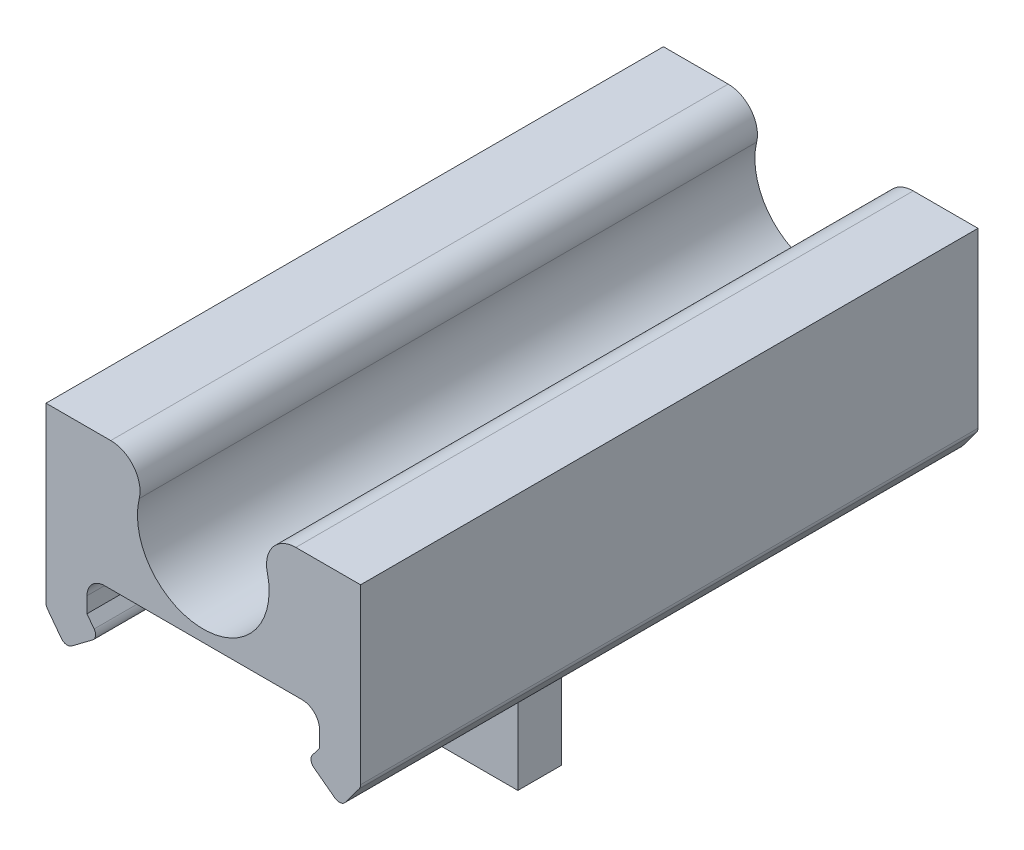
ISO-10303-21;
HEADER;
FILE_DESCRIPTION(('STEP AP214'),'2;1');
FILE_NAME('part.step','',(''),(''),'','','');
FILE_SCHEMA(('AUTOMOTIVE_DESIGN { 1 0 10303 214 1 1 1 1 }'));
ENDSEC;
DATA;
#1=APPLICATION_CONTEXT('core data for automotive mechanical design processes');
#2=APPLICATION_PROTOCOL_DEFINITION('international standard','automotive_design',2000,#1);
#3=PRODUCT_CONTEXT('',#1,'mechanical');
#4=PRODUCT('Part','Part','',(#3));
#5=PRODUCT_RELATED_PRODUCT_CATEGORY('part','',(#4));
#6=PRODUCT_DEFINITION_FORMATION('','',#4);
#7=PRODUCT_DEFINITION_CONTEXT('part definition',#1,'design');
#8=PRODUCT_DEFINITION('design','',#6,#7);
#9=PRODUCT_DEFINITION_SHAPE('','',#8);
#10=(LENGTH_UNIT() NAMED_UNIT(*) SI_UNIT(.MILLI.,.METRE.));
#11=(NAMED_UNIT(*) PLANE_ANGLE_UNIT() SI_UNIT($,.RADIAN.));
#12=(NAMED_UNIT(*) SI_UNIT($,.STERADIAN.) SOLID_ANGLE_UNIT());
#13=UNCERTAINTY_MEASURE_WITH_UNIT(LENGTH_MEASURE(1.E-05),#10,'distance_accuracy_value','');
#14=(GEOMETRIC_REPRESENTATION_CONTEXT(3) GLOBAL_UNCERTAINTY_ASSIGNED_CONTEXT((#13)) GLOBAL_UNIT_ASSIGNED_CONTEXT((#10,
#11,#12)) REPRESENTATION_CONTEXT('',''));
#15=CARTESIAN_POINT('',(0.,0.,0.));
#16=DIRECTION('',(0.,0.,1.));
#17=DIRECTION('',(1.,0.,0.));
#18=AXIS2_PLACEMENT_3D('',#15,#16,#17);
#19=CARTESIAN_POINT('',(0.,29.3,0.));
#20=DIRECTION('',(0.,1.,0.));
#21=DIRECTION('',(0.,0.,1.));
#22=AXIS2_PLACEMENT_3D('',#19,#20,#21);
#23=PLANE('',#22);
#24=DIRECTION('',(1.,0.,0.));
#25=VECTOR('',#24,1.);
#26=CARTESIAN_POINT('',(-16.,29.3,0.));
#27=LINE('',#26,#25);
#28=CARTESIAN_POINT('',(-16.,29.3,0.));
#29=VERTEX_POINT('',#28);
#30=CARTESIAN_POINT('',(-11.5745553203368,29.3,0.));
#31=VERTEX_POINT('',#30);
#32=EDGE_CURVE('E260',#29,#31,#27,.T.);
#33=ORIENTED_EDGE('',*,*,#32,.T.);
#34=DIRECTION('',(0.,0.,-1.));
#35=VECTOR('',#34,1.);
#36=CARTESIAN_POINT('',(-11.5745553203368,29.3,-42.2));
#37=LINE('',#36,#35);
#38=CARTESIAN_POINT('',(-11.5745553203368,29.3,-42.2));
#39=VERTEX_POINT('',#38);
#40=EDGE_CURVE('E381',#31,#39,#37,.T.);
#41=ORIENTED_EDGE('',*,*,#40,.T.);
#42=DIRECTION('',(-1.,0.,0.));
#43=VECTOR('',#42,1.);
#44=CARTESIAN_POINT('',(5.49999999999991,29.3,-42.2));
#45=LINE('',#44,#43);
#46=CARTESIAN_POINT('',(-16.,29.3,-42.2));
#47=VERTEX_POINT('',#46);
#48=EDGE_CURVE('E244',#39,#47,#45,.T.);
#49=ORIENTED_EDGE('',*,*,#48,.T.);
#50=DIRECTION('',(0.,0.,1.));
#51=VECTOR('',#50,1.);
#52=CARTESIAN_POINT('',(-16.,29.3,-42.2));
#53=LINE('',#52,#51);
#54=EDGE_CURVE('E243',#47,#29,#53,.T.);
#55=ORIENTED_EDGE('',*,*,#54,.T.);
#56=EDGE_LOOP('',(#33,#41,#49,#55));
#57=FACE_BOUND('',#56,.T.);
#58=ADVANCED_FACE('F41',(#57),#23,.T.);
#59=CARTESIAN_POINT('',(0.,20.5,0.));
#60=DIRECTION('',(0.,-1.,0.));
#61=DIRECTION('',(0.,0.,-1.));
#62=AXIS2_PLACEMENT_3D('',#59,#60,#61);
#63=PLANE('',#62);
#64=DIRECTION('',(-1.,0.,0.));
#65=VECTOR('',#64,1.);
#66=CARTESIAN_POINT('',(0.,20.5,-42.2));
#67=LINE('',#66,#65);
#68=CARTESIAN_POINT('',(1.49999999999991,20.5,-42.2));
#69=VERTEX_POINT('',#68);
#70=CARTESIAN_POINT('',(-12.,20.5,-42.2));
#71=VERTEX_POINT('',#70);
#72=EDGE_CURVE('E317',#69,#71,#67,.T.);
#73=ORIENTED_EDGE('',*,*,#72,.F.);
#74=DIRECTION('',(0.,0.,-1.));
#75=VECTOR('',#74,1.);
#76=CARTESIAN_POINT('',(1.49999999999991,20.5,0.));
#77=LINE('',#76,#75);
#78=CARTESIAN_POINT('',(1.49999999999991,20.5,0.));
#79=VERTEX_POINT('',#78);
#80=EDGE_CURVE('E339',#79,#69,#77,.T.);
#81=ORIENTED_EDGE('',*,*,#80,.F.);
#82=DIRECTION('',(-1.,0.,0.));
#83=VECTOR('',#82,1.);
#84=CARTESIAN_POINT('',(0.,20.5,0.));
#85=LINE('',#84,#83);
#86=CARTESIAN_POINT('',(-12.,20.5,0.));
#87=VERTEX_POINT('',#86);
#88=EDGE_CURVE('E299',#79,#87,#85,.T.);
#89=ORIENTED_EDGE('',*,*,#88,.T.);
#90=DIRECTION('',(0.,0.,-1.));
#91=VECTOR('',#90,1.);
#92=CARTESIAN_POINT('',(-12.,20.5,0.));
#93=LINE('',#92,#91);
#94=EDGE_CURVE('E341',#87,#71,#93,.T.);
#95=ORIENTED_EDGE('',*,*,#94,.T.);
#96=EDGE_LOOP('',(#73,#81,#89,#95));
#97=FACE_BOUND('',#96,.T.);
#98=DIRECTION('',(1.,0.,0.));
#99=VECTOR('',#98,1.);
#100=CARTESIAN_POINT('',(-10.2500000000001,20.5,-19.5));
#101=LINE('',#100,#99);
#102=CARTESIAN_POINT('',(-10.2500000000001,20.5,-19.5));
#103=VERTEX_POINT('',#102);
#104=CARTESIAN_POINT('',(-0.250000000000049,20.5,-19.5));
#105=VERTEX_POINT('',#104);
#106=EDGE_CURVE('E277',#103,#105,#101,.T.);
#107=ORIENTED_EDGE('',*,*,#106,.F.);
#108=DIRECTION('',(0.,0.,-1.));
#109=VECTOR('',#108,1.);
#110=CARTESIAN_POINT('',(-10.2500000000001,20.5,-16.5));
#111=LINE('',#110,#109);
#112=CARTESIAN_POINT('',(-10.2500000000001,20.5,-16.5));
#113=VERTEX_POINT('',#112);
#114=EDGE_CURVE('E263',#113,#103,#111,.T.);
#115=ORIENTED_EDGE('',*,*,#114,.F.);
#116=DIRECTION('',(-1.,0.,0.));
#117=VECTOR('',#116,1.);
#118=CARTESIAN_POINT('',(-10.2500000000001,20.5,-16.5));
#119=LINE('',#118,#117);
#120=CARTESIAN_POINT('',(-0.250000000000051,20.5,-16.5));
#121=VERTEX_POINT('',#120);
#122=EDGE_CURVE('E268',#121,#113,#119,.T.);
#123=ORIENTED_EDGE('',*,*,#122,.F.);
#124=DIRECTION('',(0.,0.,1.));
#125=VECTOR('',#124,1.);
#126=CARTESIAN_POINT('',(-0.250000000000051,20.5,-16.5));
#127=LINE('',#126,#125);
#128=EDGE_CURVE('E279',#105,#121,#127,.T.);
#129=ORIENTED_EDGE('',*,*,#128,.F.);
#130=EDGE_LOOP('',(#107,#115,#123,#129));
#131=FACE_BOUND('',#130,.T.);
#132=ADVANCED_FACE('F462',(#97,#131),#63,.T.);
#133=CARTESIAN_POINT('',(0.,0.,0.));
#134=DIRECTION('',(0.,0.,1.));
#135=DIRECTION('',(1.,0.,0.));
#136=AXIS2_PLACEMENT_3D('',#133,#134,#135);
#137=PLANE('',#136);
#138=DIRECTION('',(0.599999999999996,0.800000000000003,0.));
#139=VECTOR('',#138,1.);
#140=CARTESIAN_POINT('',(-7.02400000000001,5.26799999999995,0.));
#141=LINE('',#140,#139);
#142=CARTESIAN_POINT('',(2.20999999999991,17.58,0.));
#143=VERTEX_POINT('',#142);
#144=CARTESIAN_POINT('',(2.69999999999992,18.2333333333333,0.));
#145=VERTEX_POINT('',#144);
#146=EDGE_CURVE('E306',#143,#145,#141,.T.);
#147=ORIENTED_EDGE('',*,*,#146,.F.);
#148=CARTESIAN_POINT('',(2.60999999999991,17.28,0.));
#149=DIRECTION('',(0.,0.,1.));
#150=DIRECTION('',(1.,0.,0.));
#151=AXIS2_PLACEMENT_3D('',#148,#149,#150);
#152=CIRCLE('',#151,0.5);
#153=CARTESIAN_POINT('',(2.30999999999991,16.88,0.));
#154=VERTEX_POINT('',#153);
#155=EDGE_CURVE('E417',#143,#154,#152,.T.);
#156=ORIENTED_EDGE('',*,*,#155,.T.);
#157=DIRECTION('',(0.799999999999999,-0.600000000000001,0.));
#158=VECTOR('',#157,1.);
#159=CARTESIAN_POINT('',(8.93399999999997,11.9119999999999,0.));
#160=LINE('',#159,#158);
#161=CARTESIAN_POINT('',(3.74999999999991,15.8,0.));
#162=VERTEX_POINT('',#161);
#163=EDGE_CURVE('E333',#154,#162,#160,.T.);
#164=ORIENTED_EDGE('',*,*,#163,.T.);
#165=CARTESIAN_POINT('',(4.04999999999991,16.2,0.));
#166=DIRECTION('',(0.,0.,1.));
#167=DIRECTION('',(1.,0.,0.));
#168=AXIS2_PLACEMENT_3D('',#165,#166,#167);
#169=CIRCLE('',#168,0.5);
#170=CARTESIAN_POINT('',(4.44999999999991,15.9,0.));
#171=VERTEX_POINT('',#170);
#172=EDGE_CURVE('E408',#162,#171,#169,.T.);
#173=ORIENTED_EDGE('',*,*,#172,.T.);
#174=DIRECTION('',(0.600000000000001,0.799999999999999,0.));
#175=VECTOR('',#174,1.);
#176=CARTESIAN_POINT('',(-4.78400000000007,3.58800000000006,0.));
#177=LINE('',#176,#175);
#178=CARTESIAN_POINT('',(5.39999999999991,17.1666666666667,0.));
#179=VERTEX_POINT('',#178);
#180=EDGE_CURVE('E360',#171,#179,#177,.T.);
#181=ORIENTED_EDGE('',*,*,#180,.T.);
#182=CARTESIAN_POINT('',(4.99999999999991,17.4666666666667,0.));
#183=DIRECTION('',(0.,0.,1.));
#184=DIRECTION('',(1.,0.,0.));
#185=AXIS2_PLACEMENT_3D('',#182,#183,#184);
#186=CIRCLE('',#185,0.5);
#187=CARTESIAN_POINT('',(5.49999999999991,17.4666666666667,0.));
#188=VERTEX_POINT('',#187);
#189=EDGE_CURVE('E56',#179,#188,#186,.T.);
#190=ORIENTED_EDGE('',*,*,#189,.T.);
#191=DIRECTION('',(0.,1.,0.));
#192=VECTOR('',#191,1.);
#193=CARTESIAN_POINT('',(5.49999999999991,0.,0.));
#194=LINE('',#193,#192);
#195=CARTESIAN_POINT('',(5.49999999999991,29.3,0.));
#196=VERTEX_POINT('',#195);
#197=EDGE_CURVE('E362',#188,#196,#194,.T.);
#198=ORIENTED_EDGE('',*,*,#197,.T.);
#199=CARTESIAN_POINT('',(1.07455532033671,29.3,0.));
#200=VERTEX_POINT('',#199);
#201=EDGE_CURVE('E249',#200,#196,#27,.T.);
#202=ORIENTED_EDGE('',*,*,#201,.F.);
#203=CARTESIAN_POINT('',(1.07455532033671,27.3,0.));
#204=DIRECTION('',(0.,0.,1.));
#205=DIRECTION('',(1.,0.,0.));
#206=AXIS2_PLACEMENT_3D('',#203,#204,#205);
#207=CIRCLE('',#206,2.);
#208=CARTESIAN_POINT('',(-0.871461701305374,26.8384615384615,0.));
#209=VERTEX_POINT('',#208);
#210=EDGE_CURVE('E377',#200,#209,#207,.T.);
#211=ORIENTED_EDGE('',*,*,#210,.T.);
#212=CARTESIAN_POINT('',(-5.25000000000005,25.8,0.));
#213=DIRECTION('',(0.,0.,1.));
#214=DIRECTION('',(1.,0.,0.));
#215=AXIS2_PLACEMENT_3D('',#212,#213,#214);
#216=CIRCLE('',#215,4.5);
#217=CARTESIAN_POINT('',(-9.62853829869473,26.8384615384615,0.));
#218=VERTEX_POINT('',#217);
#219=EDGE_CURVE('E254',#218,#209,#216,.T.);
#220=ORIENTED_EDGE('',*,*,#219,.F.);
#221=CARTESIAN_POINT('',(-11.5745553203368,27.3,0.));
#222=DIRECTION('',(0.,0.,1.));
#223=DIRECTION('',(1.,0.,0.));
#224=AXIS2_PLACEMENT_3D('',#221,#222,#223);
#225=CIRCLE('',#224,2.);
#226=EDGE_CURVE('E379',#218,#31,#225,.T.);
#227=ORIENTED_EDGE('',*,*,#226,.T.);
#228=ORIENTED_EDGE('',*,*,#32,.F.);
#229=DIRECTION('',(0.,-1.,0.));
#230=VECTOR('',#229,1.);
#231=CARTESIAN_POINT('',(-16.,0.,0.));
#232=LINE('',#231,#230);
#233=CARTESIAN_POINT('',(-16.,17.4666666666667,0.));
#234=VERTEX_POINT('',#233);
#235=EDGE_CURVE('E364',#29,#234,#232,.T.);
#236=ORIENTED_EDGE('',*,*,#235,.T.);
#237=CARTESIAN_POINT('',(-15.5,17.4666666666667,0.));
#238=DIRECTION('',(0.,0.,1.));
#239=DIRECTION('',(1.,0.,0.));
#240=AXIS2_PLACEMENT_3D('',#237,#238,#239);
#241=CIRCLE('',#240,0.5);
#242=CARTESIAN_POINT('',(-15.9,17.1666666666667,0.));
#243=VERTEX_POINT('',#242);
#244=EDGE_CURVE('E413',#234,#243,#241,.T.);
#245=ORIENTED_EDGE('',*,*,#244,.T.);
#246=DIRECTION('',(0.600000000000003,-0.799999999999998,0.));
#247=VECTOR('',#246,1.);
#248=CARTESIAN_POINT('',(-1.93599999999995,-1.45199999999997,0.));
#249=LINE('',#248,#247);
#250=CARTESIAN_POINT('',(-14.95,15.9,0.));
#251=VERTEX_POINT('',#250);
#252=EDGE_CURVE('E367',#243,#251,#249,.T.);
#253=ORIENTED_EDGE('',*,*,#252,.T.);
#254=CARTESIAN_POINT('',(-14.55,16.2,0.));
#255=DIRECTION('',(0.,0.,1.));
#256=DIRECTION('',(1.,0.,0.));
#257=AXIS2_PLACEMENT_3D('',#254,#255,#256);
#258=CIRCLE('',#257,0.5);
#259=CARTESIAN_POINT('',(-14.25,15.8,0.));
#260=VERTEX_POINT('',#259);
#261=EDGE_CURVE('E411',#251,#260,#258,.T.);
#262=ORIENTED_EDGE('',*,*,#261,.T.);
#263=DIRECTION('',(-0.799999999999999,-0.600000000000001,0.));
#264=VECTOR('',#263,1.);
#265=CARTESIAN_POINT('',(-12.714,16.952,0.));
#266=LINE('',#265,#264);
#267=CARTESIAN_POINT('',(-12.81,16.88,0.));
#268=VERTEX_POINT('',#267);
#269=EDGE_CURVE('E347',#268,#260,#266,.T.);
#270=ORIENTED_EDGE('',*,*,#269,.F.);
#271=CARTESIAN_POINT('',(-13.11,17.28,0.));
#272=DIRECTION('',(0.,0.,1.));
#273=DIRECTION('',(1.,0.,0.));
#274=AXIS2_PLACEMENT_3D('',#271,#272,#273);
#275=CIRCLE('',#274,0.5);
#276=CARTESIAN_POINT('',(-12.71,17.58,0.));
#277=VERTEX_POINT('',#276);
#278=EDGE_CURVE('E415',#268,#277,#275,.T.);
#279=ORIENTED_EDGE('',*,*,#278,.T.);
#280=DIRECTION('',(0.599999999999996,-0.800000000000003,0.));
#281=VECTOR('',#280,1.);
#282=CARTESIAN_POINT('',(0.303999999999906,0.227999999999925,0.));
#283=LINE('',#282,#281);
#284=CARTESIAN_POINT('',(-13.2,18.2333333333333,0.));
#285=VERTEX_POINT('',#284);
#286=EDGE_CURVE('E308',#285,#277,#283,.T.);
#287=ORIENTED_EDGE('',*,*,#286,.F.);
#288=DIRECTION('',(0.,-1.,0.));
#289=VECTOR('',#288,1.);
#290=CARTESIAN_POINT('',(-13.2,0.,0.));
#291=LINE('',#290,#289);
#292=CARTESIAN_POINT('',(-13.2,19.3,0.));
#293=VERTEX_POINT('',#292);
#294=EDGE_CURVE('E293',#293,#285,#291,.T.);
#295=ORIENTED_EDGE('',*,*,#294,.F.);
#296=CARTESIAN_POINT('',(-12.,19.3,0.));
#297=DIRECTION('',(0.,0.,-1.));
#298=DIRECTION('',(-1.,0.,0.));
#299=AXIS2_PLACEMENT_3D('',#296,#297,#298);
#300=CIRCLE('',#299,1.2);
#301=EDGE_CURVE('E295',#293,#87,#300,.T.);
#302=ORIENTED_EDGE('',*,*,#301,.T.);
#303=ORIENTED_EDGE('',*,*,#88,.F.);
#304=CARTESIAN_POINT('',(1.49999999999991,19.3,0.));
#305=DIRECTION('',(0.,0.,-1.));
#306=DIRECTION('',(-1.,0.,0.));
#307=AXIS2_PLACEMENT_3D('',#304,#305,#306);
#308=CIRCLE('',#307,1.2);
#309=CARTESIAN_POINT('',(2.69999999999991,19.3,0.));
#310=VERTEX_POINT('',#309);
#311=EDGE_CURVE('E301',#79,#310,#308,.T.);
#312=ORIENTED_EDGE('',*,*,#311,.T.);
#313=DIRECTION('',(0.,1.,0.));
#314=VECTOR('',#313,1.);
#315=CARTESIAN_POINT('',(2.69999999999991,0.,0.));
#316=LINE('',#315,#314);
#317=EDGE_CURVE('E304',#145,#310,#316,.T.);
#318=ORIENTED_EDGE('',*,*,#317,.F.);
#319=EDGE_LOOP('',(#147,#156,#164,#173,#181,#190,#198,#202,#211,#220,#227,#228,#236,#245,#253,
#262,#270,#279,#287,#295,#302,#303,#312,#318));
#320=FACE_BOUND('',#319,.T.);
#321=ADVANCED_FACE('F441',(#320),#137,.T.);
#322=CARTESIAN_POINT('',(8.93399999999997,11.9119999999999,-64.7497228364341));
#323=DIRECTION('',(-0.600000000000001,-0.799999999999999,0.));
#324=DIRECTION('',(0.799999999999999,-0.600000000000001,0.));
#325=AXIS2_PLACEMENT_3D('',#322,#323,#324);
#326=PLANE('',#325);
#327=ORIENTED_EDGE('',*,*,#163,.F.);
#328=DIRECTION('',(0.,0.,-1.));
#329=VECTOR('',#328,1.);
#330=CARTESIAN_POINT('',(2.30999999999991,16.88,-64.7497228364341));
#331=LINE('',#330,#329);
#332=CARTESIAN_POINT('',(2.30999999999991,16.88,-42.2));
#333=VERTEX_POINT('',#332);
#334=EDGE_CURVE('E391',#154,#333,#331,.T.);
#335=ORIENTED_EDGE('',*,*,#334,.T.);
#336=DIRECTION('',(-0.799999999999999,0.600000000000001,0.));
#337=VECTOR('',#336,1.);
#338=CARTESIAN_POINT('',(8.93399999999997,11.9119999999999,-42.2));
#339=LINE('',#338,#337);
#340=CARTESIAN_POINT('',(3.74999999999991,15.8,-42.2));
#341=VERTEX_POINT('',#340);
#342=EDGE_CURVE('E345',#341,#333,#339,.T.);
#343=ORIENTED_EDGE('',*,*,#342,.F.);
#344=DIRECTION('',(0.,0.,1.));
#345=VECTOR('',#344,1.);
#346=CARTESIAN_POINT('',(3.74999999999991,15.8,-64.7497228364341));
#347=LINE('',#346,#345);
#348=EDGE_CURVE('E388',#341,#162,#347,.T.);
#349=ORIENTED_EDGE('',*,*,#348,.T.);
#350=EDGE_LOOP('',(#327,#335,#343,#349));
#351=FACE_BOUND('',#350,.T.);
#352=ADVANCED_FACE('F448',(#351),#326,.T.);
#353=CARTESIAN_POINT('',(-12.714,16.952,-64.7497228364341));
#354=DIRECTION('',(-0.600000000000001,0.799999999999999,0.));
#355=DIRECTION('',(-0.799999999999999,-0.600000000000001,0.));
#356=AXIS2_PLACEMENT_3D('',#353,#354,#355);
#357=PLANE('',#356);
#358=DIRECTION('',(0.799999999999999,0.600000000000001,0.));
#359=VECTOR('',#358,1.);
#360=CARTESIAN_POINT('',(-12.714,16.952,-42.2));
#361=LINE('',#360,#359);
#362=CARTESIAN_POINT('',(-14.25,15.8,-42.2));
#363=VERTEX_POINT('',#362);
#364=CARTESIAN_POINT('',(-12.81,16.88,-42.2));
#365=VERTEX_POINT('',#364);
#366=EDGE_CURVE('E354',#363,#365,#361,.T.);
#367=ORIENTED_EDGE('',*,*,#366,.T.);
#368=DIRECTION('',(0.,0.,-1.));
#369=VECTOR('',#368,1.);
#370=CARTESIAN_POINT('',(-12.81,16.88,0.));
#371=LINE('',#370,#369);
#372=EDGE_CURVE('E424',#365,#268,#371,.F.);
#373=ORIENTED_EDGE('',*,*,#372,.T.);
#374=ORIENTED_EDGE('',*,*,#269,.T.);
#375=DIRECTION('',(0.,0.,1.));
#376=VECTOR('',#375,1.);
#377=CARTESIAN_POINT('',(-14.25,15.8,-42.2));
#378=LINE('',#377,#376);
#379=EDGE_CURVE('E422',#260,#363,#378,.F.);
#380=ORIENTED_EDGE('',*,*,#379,.T.);
#381=EDGE_LOOP('',(#367,#373,#374,#380));
#382=FACE_BOUND('',#381,.T.);
#383=ADVANCED_FACE('F528',(#382),#357,.F.);
#384=CARTESIAN_POINT('',(-10.,3.,-42.2));
#385=DIRECTION('',(0.,0.,1.));
#386=DIRECTION('',(1.,0.,0.));
#387=AXIS2_PLACEMENT_3D('',#384,#385,#386);
#388=PLANE('',#387);
#389=ORIENTED_EDGE('',*,*,#342,.T.);
#390=CARTESIAN_POINT('',(2.60999999999991,17.28,-42.2));
#391=DIRECTION('',(0.,0.,1.));
#392=DIRECTION('',(1.,0.,0.));
#393=AXIS2_PLACEMENT_3D('',#390,#391,#392);
#394=CIRCLE('',#393,0.5);
#395=CARTESIAN_POINT('',(2.20999999999991,17.58,-42.2));
#396=VERTEX_POINT('',#395);
#397=EDGE_CURVE('E404',#333,#396,#394,.F.);
#398=ORIENTED_EDGE('',*,*,#397,.T.);
#399=DIRECTION('',(0.599999999999996,0.800000000000003,0.));
#400=VECTOR('',#399,1.);
#401=CARTESIAN_POINT('',(-7.02400000000001,5.26799999999995,-42.2));
#402=LINE('',#401,#400);
#403=CARTESIAN_POINT('',(2.69999999999991,18.2333333333333,-42.2));
#404=VERTEX_POINT('',#403);
#405=EDGE_CURVE('E326',#396,#404,#402,.T.);
#406=ORIENTED_EDGE('',*,*,#405,.T.);
#407=DIRECTION('',(0.,1.,0.));
#408=VECTOR('',#407,1.);
#409=CARTESIAN_POINT('',(2.69999999999991,0.,-42.2));
#410=LINE('',#409,#408);
#411=CARTESIAN_POINT('',(2.69999999999991,19.3,-42.2));
#412=VERTEX_POINT('',#411);
#413=EDGE_CURVE('E323',#404,#412,#410,.T.);
#414=ORIENTED_EDGE('',*,*,#413,.T.);
#415=CARTESIAN_POINT('',(1.49999999999991,19.3,-42.2));
#416=DIRECTION('',(0.,0.,-1.));
#417=DIRECTION('',(-1.,0.,0.));
#418=AXIS2_PLACEMENT_3D('',#415,#416,#417);
#419=CIRCLE('',#418,1.2);
#420=EDGE_CURVE('E320',#69,#412,#419,.T.);
#421=ORIENTED_EDGE('',*,*,#420,.F.);
#422=ORIENTED_EDGE('',*,*,#72,.T.);
#423=CARTESIAN_POINT('',(-12.,19.3,-42.2));
#424=DIRECTION('',(0.,0.,-1.));
#425=DIRECTION('',(-1.,0.,0.));
#426=AXIS2_PLACEMENT_3D('',#423,#424,#425);
#427=CIRCLE('',#426,1.2);
#428=CARTESIAN_POINT('',(-13.2,19.3,-42.2));
#429=VERTEX_POINT('',#428);
#430=EDGE_CURVE('E314',#429,#71,#427,.T.);
#431=ORIENTED_EDGE('',*,*,#430,.F.);
#432=DIRECTION('',(0.,-1.,0.));
#433=VECTOR('',#432,1.);
#434=CARTESIAN_POINT('',(-13.2,0.,-42.2));
#435=LINE('',#434,#433);
#436=CARTESIAN_POINT('',(-13.2,18.2333333333333,-42.2));
#437=VERTEX_POINT('',#436);
#438=EDGE_CURVE('E292',#429,#437,#435,.T.);
#439=ORIENTED_EDGE('',*,*,#438,.T.);
#440=DIRECTION('',(0.599999999999996,-0.800000000000003,0.));
#441=VECTOR('',#440,1.);
#442=CARTESIAN_POINT('',(0.303999999999903,0.227999999999925,-42.2));
#443=LINE('',#442,#441);
#444=CARTESIAN_POINT('',(-12.71,17.58,-42.2));
#445=VERTEX_POINT('',#444);
#446=EDGE_CURVE('E296',#437,#445,#443,.T.);
#447=ORIENTED_EDGE('',*,*,#446,.T.);
#448=CARTESIAN_POINT('',(-13.11,17.28,-42.2));
#449=DIRECTION('',(0.,0.,1.));
#450=DIRECTION('',(1.,0.,0.));
#451=AXIS2_PLACEMENT_3D('',#448,#449,#450);
#452=CIRCLE('',#451,0.5);
#453=EDGE_CURVE('E402',#445,#365,#452,.F.);
#454=ORIENTED_EDGE('',*,*,#453,.T.);
#455=ORIENTED_EDGE('',*,*,#366,.F.);
#456=CARTESIAN_POINT('',(-14.55,16.2,-42.2));
#457=DIRECTION('',(0.,0.,1.));
#458=DIRECTION('',(1.,0.,0.));
#459=AXIS2_PLACEMENT_3D('',#456,#457,#458);
#460=CIRCLE('',#459,0.5);
#461=CARTESIAN_POINT('',(-14.95,15.9,-42.2));
#462=VERTEX_POINT('',#461);
#463=EDGE_CURVE('E398',#363,#462,#460,.F.);
#464=ORIENTED_EDGE('',*,*,#463,.T.);
#465=DIRECTION('',(-0.600000000000002,0.799999999999998,0.));
#466=VECTOR('',#465,1.);
#467=CARTESIAN_POINT('',(-1.93599999999995,-1.45199999999997,-42.2));
#468=LINE('',#467,#466);
#469=CARTESIAN_POINT('',(-15.9,17.1666666666667,-42.2));
#470=VERTEX_POINT('',#469);
#471=EDGE_CURVE('E351',#462,#470,#468,.T.);
#472=ORIENTED_EDGE('',*,*,#471,.T.);
#473=CARTESIAN_POINT('',(-15.5,17.4666666666667,-42.2));
#474=DIRECTION('',(0.,0.,1.));
#475=DIRECTION('',(1.,0.,0.));
#476=AXIS2_PLACEMENT_3D('',#473,#474,#475);
#477=CIRCLE('',#476,0.5);
#478=CARTESIAN_POINT('',(-16.,17.4666666666667,-42.2));
#479=VERTEX_POINT('',#478);
#480=EDGE_CURVE('E400',#470,#479,#477,.F.);
#481=ORIENTED_EDGE('',*,*,#480,.T.);
#482=DIRECTION('',(0.,1.,0.));
#483=VECTOR('',#482,1.);
#484=CARTESIAN_POINT('',(-16.,0.,-42.2));
#485=LINE('',#484,#483);
#486=EDGE_CURVE('E232',#479,#47,#485,.T.);
#487=ORIENTED_EDGE('',*,*,#486,.T.);
#488=ORIENTED_EDGE('',*,*,#48,.F.);
#489=CARTESIAN_POINT('',(-11.5745553203368,27.3,-42.2));
#490=DIRECTION('',(0.,0.,1.));
#491=DIRECTION('',(1.,0.,0.));
#492=AXIS2_PLACEMENT_3D('',#489,#490,#491);
#493=CIRCLE('',#492,2.);
#494=CARTESIAN_POINT('',(-9.62853829869473,26.8384615384615,-42.2));
#495=VERTEX_POINT('',#494);
#496=EDGE_CURVE('E384',#39,#495,#493,.F.);
#497=ORIENTED_EDGE('',*,*,#496,.T.);
#498=CARTESIAN_POINT('',(-5.25000000000005,25.8,-42.2));
#499=DIRECTION('',(0.,0.,1.));
#500=DIRECTION('',(1.,0.,0.));
#501=AXIS2_PLACEMENT_3D('',#498,#499,#500);
#502=CIRCLE('',#501,4.5);
#503=CARTESIAN_POINT('',(-0.871461701305374,26.8384615384615,-42.2));
#504=VERTEX_POINT('',#503);
#505=EDGE_CURVE('E250',#504,#495,#502,.F.);
#506=ORIENTED_EDGE('',*,*,#505,.F.);
#507=CARTESIAN_POINT('',(1.07455532033671,27.3,-42.2));
#508=DIRECTION('',(0.,0.,1.));
#509=DIRECTION('',(1.,0.,0.));
#510=AXIS2_PLACEMENT_3D('',#507,#508,#509);
#511=CIRCLE('',#510,2.);
#512=CARTESIAN_POINT('',(1.07455532033671,29.3,-42.2));
#513=VERTEX_POINT('',#512);
#514=EDGE_CURVE('E240',#504,#513,#511,.F.);
#515=ORIENTED_EDGE('',*,*,#514,.T.);
#516=CARTESIAN_POINT('',(5.49999999999991,29.3,-42.2));
#517=VERTEX_POINT('',#516);
#518=EDGE_CURVE('E236',#517,#513,#45,.T.);
#519=ORIENTED_EDGE('',*,*,#518,.F.);
#520=DIRECTION('',(0.,-1.,0.));
#521=VECTOR('',#520,1.);
#522=CARTESIAN_POINT('',(5.49999999999991,0.,-42.2));
#523=LINE('',#522,#521);
#524=CARTESIAN_POINT('',(5.49999999999991,17.4666666666667,-42.2));
#525=VERTEX_POINT('',#524);
#526=EDGE_CURVE('E225',#517,#525,#523,.T.);
#527=ORIENTED_EDGE('',*,*,#526,.T.);
#528=CARTESIAN_POINT('',(4.99999999999991,17.4666666666667,-42.2));
#529=DIRECTION('',(0.,0.,1.));
#530=DIRECTION('',(1.,0.,0.));
#531=AXIS2_PLACEMENT_3D('',#528,#529,#530);
#532=CIRCLE('',#531,0.5);
#533=CARTESIAN_POINT('',(5.39999999999991,17.1666666666667,-42.2));
#534=VERTEX_POINT('',#533);
#535=EDGE_CURVE('E396',#525,#534,#532,.F.);
#536=ORIENTED_EDGE('',*,*,#535,.T.);
#537=DIRECTION('',(-0.600000000000001,-0.799999999999999,0.));
#538=VECTOR('',#537,1.);
#539=CARTESIAN_POINT('',(-4.78400000000007,3.58800000000007,-42.2));
#540=LINE('',#539,#538);
#541=CARTESIAN_POINT('',(4.44999999999991,15.9,-42.2));
#542=VERTEX_POINT('',#541);
#543=EDGE_CURVE('E233',#534,#542,#540,.T.);
#544=ORIENTED_EDGE('',*,*,#543,.T.);
#545=CARTESIAN_POINT('',(4.04999999999991,16.2,-42.2));
#546=DIRECTION('',(0.,0.,1.));
#547=DIRECTION('',(1.,0.,0.));
#548=AXIS2_PLACEMENT_3D('',#545,#546,#547);
#549=CIRCLE('',#548,0.5);
#550=EDGE_CURVE('E394',#542,#341,#549,.F.);
#551=ORIENTED_EDGE('',*,*,#550,.T.);
#552=EDGE_LOOP('',(#389,#398,#406,#414,#421,#422,#431,#439,#447,#454,#455,#464,#472,#481,#487,
#488,#497,#506,#515,#519,#527,#536,#544,#551));
#553=FACE_BOUND('',#552,.T.);
#554=ADVANCED_FACE('F238',(#553),#388,.F.);
#555=CARTESIAN_POINT('',(-4.78400000000007,3.58800000000006,-64.7497228364341));
#556=DIRECTION('',(0.799999999999999,-0.600000000000001,0.));
#557=DIRECTION('',(0.600000000000001,0.799999999999999,0.));
#558=AXIS2_PLACEMENT_3D('',#555,#556,#557);
#559=PLANE('',#558);
#560=ORIENTED_EDGE('',*,*,#543,.F.);
#561=DIRECTION('',(0.,0.,1.));
#562=VECTOR('',#561,1.);
#563=CARTESIAN_POINT('',(5.39999999999991,17.1666666666667,-64.7497228364341));
#564=LINE('',#563,#562);
#565=EDGE_CURVE('E49',#534,#179,#564,.T.);
#566=ORIENTED_EDGE('',*,*,#565,.T.);
#567=ORIENTED_EDGE('',*,*,#180,.F.);
#568=DIRECTION('',(0.,0.,1.));
#569=VECTOR('',#568,1.);
#570=CARTESIAN_POINT('',(4.4499999999999,15.9,-64.7497228364341));
#571=LINE('',#570,#569);
#572=EDGE_CURVE('E434',#171,#542,#571,.F.);
#573=ORIENTED_EDGE('',*,*,#572,.T.);
#574=EDGE_LOOP('',(#560,#566,#567,#573));
#575=FACE_BOUND('',#574,.T.);
#576=ADVANCED_FACE('F438',(#575),#559,.T.);
#577=CARTESIAN_POINT('',(5.49999999999991,0.,-64.7497228364341));
#578=DIRECTION('',(1.,0.,0.));
#579=DIRECTION('',(0.,0.,-1.));
#580=AXIS2_PLACEMENT_3D('',#577,#578,#579);
#581=PLANE('',#580);
#582=ORIENTED_EDGE('',*,*,#197,.F.);
#583=DIRECTION('',(0.,0.,1.));
#584=VECTOR('',#583,1.);
#585=CARTESIAN_POINT('',(5.49999999999991,17.4666666666667,-64.7497228364341));
#586=LINE('',#585,#584);
#587=EDGE_CURVE('E11',#188,#525,#586,.F.);
#588=ORIENTED_EDGE('',*,*,#587,.T.);
#589=ORIENTED_EDGE('',*,*,#526,.F.);
#590=DIRECTION('',(0.,0.,-1.));
#591=VECTOR('',#590,1.);
#592=CARTESIAN_POINT('',(5.49999999999991,29.3,0.));
#593=LINE('',#592,#591);
#594=EDGE_CURVE('E229',#196,#517,#593,.T.);
#595=ORIENTED_EDGE('',*,*,#594,.F.);
#596=EDGE_LOOP('',(#582,#588,#589,#595));
#597=FACE_BOUND('',#596,.T.);
#598=ADVANCED_FACE('F227',(#597),#581,.T.);
#599=CARTESIAN_POINT('',(-16.,0.,-64.7497228364341));
#600=DIRECTION('',(-1.,0.,0.));
#601=DIRECTION('',(0.,0.,1.));
#602=AXIS2_PLACEMENT_3D('',#599,#600,#601);
#603=PLANE('',#602);
#604=ORIENTED_EDGE('',*,*,#486,.F.);
#605=DIRECTION('',(0.,0.,1.));
#606=VECTOR('',#605,1.);
#607=CARTESIAN_POINT('',(-16.,17.4666666666667,-64.7497228364341));
#608=LINE('',#607,#606);
#609=EDGE_CURVE('E426',#479,#234,#608,.T.);
#610=ORIENTED_EDGE('',*,*,#609,.T.);
#611=ORIENTED_EDGE('',*,*,#235,.F.);
#612=ORIENTED_EDGE('',*,*,#54,.F.);
#613=EDGE_LOOP('',(#604,#610,#611,#612));
#614=FACE_BOUND('',#613,.T.);
#615=ADVANCED_FACE('F536',(#614),#603,.T.);
#616=CARTESIAN_POINT('',(-1.93599999999995,-1.45199999999997,-64.7497228364341));
#617=DIRECTION('',(-0.799999999999998,-0.600000000000002,0.));
#618=DIRECTION('',(0.600000000000002,-0.799999999999998,0.));
#619=AXIS2_PLACEMENT_3D('',#616,#617,#618);
#620=PLANE('',#619);
#621=ORIENTED_EDGE('',*,*,#252,.F.);
#622=DIRECTION('',(0.,0.,1.));
#623=VECTOR('',#622,1.);
#624=CARTESIAN_POINT('',(-15.9,17.1666666666667,-64.7497228364341));
#625=LINE('',#624,#623);
#626=EDGE_CURVE('E432',#243,#470,#625,.F.);
#627=ORIENTED_EDGE('',*,*,#626,.T.);
#628=ORIENTED_EDGE('',*,*,#471,.F.);
#629=DIRECTION('',(0.,0.,1.));
#630=VECTOR('',#629,1.);
#631=CARTESIAN_POINT('',(-14.95,15.9,0.));
#632=LINE('',#631,#630);
#633=EDGE_CURVE('E429',#462,#251,#632,.T.);
#634=ORIENTED_EDGE('',*,*,#633,.T.);
#635=EDGE_LOOP('',(#621,#627,#628,#634));
#636=FACE_BOUND('',#635,.T.);
#637=ADVANCED_FACE('F524',(#636),#620,.T.);
#638=CARTESIAN_POINT('',(-13.2,0.,0.));
#639=DIRECTION('',(1.,0.,0.));
#640=DIRECTION('',(0.,0.,-1.));
#641=AXIS2_PLACEMENT_3D('',#638,#639,#640);
#642=PLANE('',#641);
#643=ORIENTED_EDGE('',*,*,#438,.F.);
#644=DIRECTION('',(0.,0.,-1.));
#645=VECTOR('',#644,1.);
#646=CARTESIAN_POINT('',(-13.2,19.3,0.));
#647=LINE('',#646,#645);
#648=EDGE_CURVE('E311',#293,#429,#647,.T.);
#649=ORIENTED_EDGE('',*,*,#648,.F.);
#650=ORIENTED_EDGE('',*,*,#294,.T.);
#651=DIRECTION('',(0.,0.,-1.));
#652=VECTOR('',#651,1.);
#653=CARTESIAN_POINT('',(-13.2,18.2333333333333,0.));
#654=LINE('',#653,#652);
#655=EDGE_CURVE('E330',#285,#437,#654,.T.);
#656=ORIENTED_EDGE('',*,*,#655,.T.);
#657=EDGE_LOOP('',(#643,#649,#650,#656));
#658=FACE_BOUND('',#657,.T.);
#659=ADVANCED_FACE('F506',(#658),#642,.T.);
#660=CARTESIAN_POINT('',(0.303999999999906,0.227999999999925,0.));
#661=DIRECTION('',(0.800000000000003,0.599999999999996,0.));
#662=DIRECTION('',(-0.599999999999996,0.800000000000003,0.));
#663=AXIS2_PLACEMENT_3D('',#660,#661,#662);
#664=PLANE('',#663);
#665=ORIENTED_EDGE('',*,*,#286,.T.);
#666=DIRECTION('',(0.,0.,-1.));
#667=VECTOR('',#666,1.);
#668=CARTESIAN_POINT('',(-12.71,17.58,-42.2));
#669=LINE('',#668,#667);
#670=EDGE_CURVE('E419',#277,#445,#669,.T.);
#671=ORIENTED_EDGE('',*,*,#670,.T.);
#672=ORIENTED_EDGE('',*,*,#446,.F.);
#673=ORIENTED_EDGE('',*,*,#655,.F.);
#674=EDGE_LOOP('',(#665,#671,#672,#673));
#675=FACE_BOUND('',#674,.T.);
#676=ADVANCED_FACE('F502',(#675),#664,.T.);
#677=CARTESIAN_POINT('',(-7.02400000000001,5.26799999999995,0.));
#678=DIRECTION('',(-0.800000000000003,0.599999999999996,0.));
#679=DIRECTION('',(-0.599999999999996,-0.800000000000003,0.));
#680=AXIS2_PLACEMENT_3D('',#677,#678,#679);
#681=PLANE('',#680);
#682=ORIENTED_EDGE('',*,*,#405,.F.);
#683=DIRECTION('',(0.,0.,-1.));
#684=VECTOR('',#683,1.);
#685=CARTESIAN_POINT('',(2.20999999999991,17.58,0.));
#686=LINE('',#685,#684);
#687=EDGE_CURVE('E406',#396,#143,#686,.F.);
#688=ORIENTED_EDGE('',*,*,#687,.T.);
#689=ORIENTED_EDGE('',*,*,#146,.T.);
#690=DIRECTION('',(0.,0.,-1.));
#691=VECTOR('',#690,1.);
#692=CARTESIAN_POINT('',(2.69999999999992,18.2333333333333,0.));
#693=LINE('',#692,#691);
#694=EDGE_CURVE('E334',#145,#404,#693,.T.);
#695=ORIENTED_EDGE('',*,*,#694,.T.);
#696=EDGE_LOOP('',(#682,#688,#689,#695));
#697=FACE_BOUND('',#696,.T.);
#698=ADVANCED_FACE('F505',(#697),#681,.T.);
#699=CARTESIAN_POINT('',(2.69999999999991,0.,0.));
#700=DIRECTION('',(-1.,0.,0.));
#701=DIRECTION('',(0.,0.,1.));
#702=AXIS2_PLACEMENT_3D('',#699,#700,#701);
#703=PLANE('',#702);
#704=ORIENTED_EDGE('',*,*,#413,.F.);
#705=ORIENTED_EDGE('',*,*,#694,.F.);
#706=ORIENTED_EDGE('',*,*,#317,.T.);
#707=DIRECTION('',(0.,0.,-1.));
#708=VECTOR('',#707,1.);
#709=CARTESIAN_POINT('',(2.69999999999991,19.3,0.));
#710=LINE('',#709,#708);
#711=EDGE_CURVE('E337',#310,#412,#710,.T.);
#712=ORIENTED_EDGE('',*,*,#711,.T.);
#713=EDGE_LOOP('',(#704,#705,#706,#712));
#714=FACE_BOUND('',#713,.T.);
#715=ADVANCED_FACE('F510',(#714),#703,.T.);
#716=CARTESIAN_POINT('',(1.49999999999991,19.3,0.));
#717=DIRECTION('',(0.,0.,-1.));
#718=DIRECTION('',(-1.,0.,0.));
#719=AXIS2_PLACEMENT_3D('',#716,#717,#718);
#720=CYLINDRICAL_SURFACE('',#719,1.2);
#721=ORIENTED_EDGE('',*,*,#420,.T.);
#722=ORIENTED_EDGE('',*,*,#711,.F.);
#723=ORIENTED_EDGE('',*,*,#311,.F.);
#724=ORIENTED_EDGE('',*,*,#80,.T.);
#725=EDGE_LOOP('',(#721,#722,#723,#724));
#726=FACE_BOUND('',#725,.T.);
#727=ADVANCED_FACE('F514',(#726),#720,.F.);
#728=CARTESIAN_POINT('',(-12.,19.3,0.));
#729=DIRECTION('',(0.,0.,-1.));
#730=DIRECTION('',(-1.,0.,0.));
#731=AXIS2_PLACEMENT_3D('',#728,#729,#730);
#732=CYLINDRICAL_SURFACE('',#731,1.2);
#733=ORIENTED_EDGE('',*,*,#430,.T.);
#734=ORIENTED_EDGE('',*,*,#94,.F.);
#735=ORIENTED_EDGE('',*,*,#301,.F.);
#736=ORIENTED_EDGE('',*,*,#648,.T.);
#737=EDGE_LOOP('',(#733,#734,#735,#736));
#738=FACE_BOUND('',#737,.T.);
#739=ADVANCED_FACE('F500',(#738),#732,.F.);
#740=CARTESIAN_POINT('',(-10.2500000000001,6.,-16.5));
#741=DIRECTION('',(1.,0.,0.));
#742=DIRECTION('',(0.,1.,0.));
#743=AXIS2_PLACEMENT_3D('',#740,#741,#742);
#744=PLANE('',#743);
#745=ORIENTED_EDGE('',*,*,#114,.T.);
#746=DIRECTION('',(0.,1.,0.));
#747=VECTOR('',#746,1.);
#748=CARTESIAN_POINT('',(-10.2500000000001,6.,-19.5));
#749=LINE('',#748,#747);
#750=CARTESIAN_POINT('',(-10.2500000000001,6.,-19.5));
#751=VERTEX_POINT('',#750);
#752=EDGE_CURVE('E290',#751,#103,#749,.T.);
#753=ORIENTED_EDGE('',*,*,#752,.F.);
#754=DIRECTION('',(0.,0.,-1.));
#755=VECTOR('',#754,1.);
#756=CARTESIAN_POINT('',(-10.2500000000001,6.,-16.5));
#757=LINE('',#756,#755);
#758=CARTESIAN_POINT('',(-10.2500000000001,6.,-16.5));
#759=VERTEX_POINT('',#758);
#760=EDGE_CURVE('E264',#759,#751,#757,.T.);
#761=ORIENTED_EDGE('',*,*,#760,.F.);
#762=DIRECTION('',(0.,1.,0.));
#763=VECTOR('',#762,1.);
#764=CARTESIAN_POINT('',(-10.2500000000001,6.,-16.5));
#765=LINE('',#764,#763);
#766=EDGE_CURVE('E274',#759,#113,#765,.T.);
#767=ORIENTED_EDGE('',*,*,#766,.T.);
#768=EDGE_LOOP('',(#745,#753,#761,#767));
#769=FACE_BOUND('',#768,.T.);
#770=ADVANCED_FACE('F496',(#769),#744,.F.);
#771=CARTESIAN_POINT('',(-10.2500000000001,6.,-19.5));
#772=DIRECTION('',(0.,0.,1.));
#773=DIRECTION('',(0.,-1.,0.));
#774=AXIS2_PLACEMENT_3D('',#771,#772,#773);
#775=PLANE('',#774);
#776=ORIENTED_EDGE('',*,*,#106,.T.);
#777=DIRECTION('',(0.,1.,0.));
#778=VECTOR('',#777,1.);
#779=CARTESIAN_POINT('',(-0.250000000000053,6.,-19.5));
#780=LINE('',#779,#778);
#781=CARTESIAN_POINT('',(-0.250000000000053,6.,-19.5));
#782=VERTEX_POINT('',#781);
#783=EDGE_CURVE('E287',#782,#105,#780,.T.);
#784=ORIENTED_EDGE('',*,*,#783,.F.);
#785=DIRECTION('',(1.,0.,0.));
#786=VECTOR('',#785,1.);
#787=CARTESIAN_POINT('',(-10.2500000000001,6.,-19.5));
#788=LINE('',#787,#786);
#789=EDGE_CURVE('E267',#751,#782,#788,.T.);
#790=ORIENTED_EDGE('',*,*,#789,.F.);
#791=ORIENTED_EDGE('',*,*,#752,.T.);
#792=EDGE_LOOP('',(#776,#784,#790,#791));
#793=FACE_BOUND('',#792,.T.);
#794=ADVANCED_FACE('F492',(#793),#775,.F.);
#795=CARTESIAN_POINT('',(-0.250000000000054,6.,-16.5));
#796=DIRECTION('',(-1.,0.,0.));
#797=DIRECTION('',(0.,0.,1.));
#798=AXIS2_PLACEMENT_3D('',#795,#796,#797);
#799=PLANE('',#798);
#800=ORIENTED_EDGE('',*,*,#128,.T.);
#801=DIRECTION('',(0.,1.,0.));
#802=VECTOR('',#801,1.);
#803=CARTESIAN_POINT('',(-0.250000000000054,6.,-16.5));
#804=LINE('',#803,#802);
#805=CARTESIAN_POINT('',(-0.250000000000054,6.,-16.5));
#806=VERTEX_POINT('',#805);
#807=EDGE_CURVE('E285',#806,#121,#804,.T.);
#808=ORIENTED_EDGE('',*,*,#807,.F.);
#809=DIRECTION('',(0.,0.,1.));
#810=VECTOR('',#809,1.);
#811=CARTESIAN_POINT('',(-0.250000000000054,6.,-16.5));
#812=LINE('',#811,#810);
#813=EDGE_CURVE('E270',#782,#806,#812,.T.);
#814=ORIENTED_EDGE('',*,*,#813,.F.);
#815=ORIENTED_EDGE('',*,*,#783,.T.);
#816=EDGE_LOOP('',(#800,#808,#814,#815));
#817=FACE_BOUND('',#816,.T.);
#818=ADVANCED_FACE('F486',(#817),#799,.F.);
#819=CARTESIAN_POINT('',(-10.2500000000001,6.,-16.5));
#820=DIRECTION('',(0.,0.,-1.));
#821=DIRECTION('',(0.,1.,0.));
#822=AXIS2_PLACEMENT_3D('',#819,#820,#821);
#823=PLANE('',#822);
#824=ORIENTED_EDGE('',*,*,#122,.T.);
#825=ORIENTED_EDGE('',*,*,#766,.F.);
#826=DIRECTION('',(-1.,0.,0.));
#827=VECTOR('',#826,1.);
#828=CARTESIAN_POINT('',(-10.2500000000001,6.,-16.5));
#829=LINE('',#828,#827);
#830=EDGE_CURVE('E272',#806,#759,#829,.T.);
#831=ORIENTED_EDGE('',*,*,#830,.F.);
#832=ORIENTED_EDGE('',*,*,#807,.T.);
#833=EDGE_LOOP('',(#824,#825,#831,#832));
#834=FACE_BOUND('',#833,.T.);
#835=ADVANCED_FACE('F481',(#834),#823,.F.);
#836=CARTESIAN_POINT('',(0.,6.,0.));
#837=DIRECTION('',(0.,-1.,0.));
#838=DIRECTION('',(1.,0.,0.));
#839=AXIS2_PLACEMENT_3D('',#836,#837,#838);
#840=PLANE('',#839);
#841=ORIENTED_EDGE('',*,*,#760,.T.);
#842=ORIENTED_EDGE('',*,*,#789,.T.);
#843=ORIENTED_EDGE('',*,*,#813,.T.);
#844=ORIENTED_EDGE('',*,*,#830,.T.);
#845=EDGE_LOOP('',(#841,#842,#843,#844));
#846=FACE_BOUND('',#845,.T.);
#847=ADVANCED_FACE('F475',(#846),#840,.T.);
#848=ORIENTED_EDGE('',*,*,#518,.T.);
#849=DIRECTION('',(0.,0.,-1.));
#850=VECTOR('',#849,1.);
#851=CARTESIAN_POINT('',(1.07455532033671,29.3,0.));
#852=LINE('',#851,#850);
#853=EDGE_CURVE('E386',#513,#200,#852,.F.);
#854=ORIENTED_EDGE('',*,*,#853,.T.);
#855=ORIENTED_EDGE('',*,*,#201,.T.);
#856=ORIENTED_EDGE('',*,*,#594,.T.);
#857=EDGE_LOOP('',(#848,#854,#855,#856));
#858=FACE_BOUND('',#857,.T.);
#859=ADVANCED_FACE('F247',(#858),#23,.T.);
#860=CARTESIAN_POINT('',(-5.25000000000005,25.8,-54.9279220613579));
#861=DIRECTION('',(0.,0.,1.));
#862=DIRECTION('',(1.,0.,0.));
#863=AXIS2_PLACEMENT_3D('',#860,#861,#862);
#864=CYLINDRICAL_SURFACE('',#863,4.5);
#865=ORIENTED_EDGE('',*,*,#505,.T.);
#866=DIRECTION('',(0.,0.,1.));
#867=VECTOR('',#866,1.);
#868=CARTESIAN_POINT('',(-9.62853829869473,26.8384615384615,-54.9279220613579));
#869=LINE('',#868,#867);
#870=EDGE_CURVE('E374',#495,#218,#869,.T.);
#871=ORIENTED_EDGE('',*,*,#870,.T.);
#872=ORIENTED_EDGE('',*,*,#219,.T.);
#873=DIRECTION('',(0.,0.,1.));
#874=VECTOR('',#873,1.);
#875=CARTESIAN_POINT('',(-0.871461701305373,26.8384615384615,-54.9279220613579));
#876=LINE('',#875,#874);
#877=EDGE_CURVE('E357',#209,#504,#876,.F.);
#878=ORIENTED_EDGE('',*,*,#877,.T.);
#879=EDGE_LOOP('',(#865,#871,#872,#878));
#880=FACE_BOUND('',#879,.T.);
#881=ADVANCED_FACE('F474',(#880),#864,.F.);
#882=CARTESIAN_POINT('',(-11.5745553203368,27.3,-54.9279220613579));
#883=DIRECTION('',(0.,0.,1.));
#884=DIRECTION('',(1.,0.,0.));
#885=AXIS2_PLACEMENT_3D('',#882,#883,#884);
#886=CYLINDRICAL_SURFACE('',#885,2.);
#887=ORIENTED_EDGE('',*,*,#496,.F.);
#888=ORIENTED_EDGE('',*,*,#40,.F.);
#889=ORIENTED_EDGE('',*,*,#226,.F.);
#890=ORIENTED_EDGE('',*,*,#870,.F.);
#891=EDGE_LOOP('',(#887,#888,#889,#890));
#892=FACE_BOUND('',#891,.T.);
#893=ADVANCED_FACE('F479',(#892),#886,.T.);
#894=CARTESIAN_POINT('',(1.07455532033671,27.3,-54.9279220613579));
#895=DIRECTION('',(0.,0.,1.));
#896=DIRECTION('',(1.,0.,0.));
#897=AXIS2_PLACEMENT_3D('',#894,#895,#896);
#898=CYLINDRICAL_SURFACE('',#897,2.);
#899=ORIENTED_EDGE('',*,*,#210,.F.);
#900=ORIENTED_EDGE('',*,*,#853,.F.);
#901=ORIENTED_EDGE('',*,*,#514,.F.);
#902=ORIENTED_EDGE('',*,*,#877,.F.);
#903=EDGE_LOOP('',(#899,#900,#901,#902));
#904=FACE_BOUND('',#903,.T.);
#905=ADVANCED_FACE('F549',(#904),#898,.T.);
#906=CARTESIAN_POINT('',(2.60999999999991,17.28,-64.7497228364341));
#907=DIRECTION('',(0.,0.,-1.));
#908=DIRECTION('',(-1.,0.,0.));
#909=AXIS2_PLACEMENT_3D('',#906,#907,#908);
#910=CYLINDRICAL_SURFACE('',#909,0.5);
#911=ORIENTED_EDGE('',*,*,#155,.F.);
#912=ORIENTED_EDGE('',*,*,#687,.F.);
#913=ORIENTED_EDGE('',*,*,#397,.F.);
#914=ORIENTED_EDGE('',*,*,#334,.F.);
#915=EDGE_LOOP('',(#911,#912,#913,#914));
#916=FACE_BOUND('',#915,.T.);
#917=ADVANCED_FACE('F553',(#916),#910,.T.);
#918=CARTESIAN_POINT('',(-13.11,17.28,0.));
#919=DIRECTION('',(0.,0.,1.));
#920=DIRECTION('',(1.,0.,0.));
#921=AXIS2_PLACEMENT_3D('',#918,#919,#920);
#922=CYLINDRICAL_SURFACE('',#921,0.5);
#923=ORIENTED_EDGE('',*,*,#278,.F.);
#924=ORIENTED_EDGE('',*,*,#372,.F.);
#925=ORIENTED_EDGE('',*,*,#453,.F.);
#926=ORIENTED_EDGE('',*,*,#670,.F.);
#927=EDGE_LOOP('',(#923,#924,#925,#926));
#928=FACE_BOUND('',#927,.T.);
#929=ADVANCED_FACE('F557',(#928),#922,.T.);
#930=CARTESIAN_POINT('',(-15.5,17.4666666666667,-64.7497228364341));
#931=DIRECTION('',(0.,0.,1.));
#932=DIRECTION('',(1.,0.,0.));
#933=AXIS2_PLACEMENT_3D('',#930,#931,#932);
#934=CYLINDRICAL_SURFACE('',#933,0.5);
#935=ORIENTED_EDGE('',*,*,#480,.F.);
#936=ORIENTED_EDGE('',*,*,#626,.F.);
#937=ORIENTED_EDGE('',*,*,#244,.F.);
#938=ORIENTED_EDGE('',*,*,#609,.F.);
#939=EDGE_LOOP('',(#935,#936,#937,#938));
#940=FACE_BOUND('',#939,.T.);
#941=ADVANCED_FACE('F458',(#940),#934,.T.);
#942=CARTESIAN_POINT('',(-14.55,16.2,-64.7497228364341));
#943=DIRECTION('',(0.,0.,-1.));
#944=DIRECTION('',(-1.,0.,0.));
#945=AXIS2_PLACEMENT_3D('',#942,#943,#944);
#946=CYLINDRICAL_SURFACE('',#945,0.5);
#947=ORIENTED_EDGE('',*,*,#463,.F.);
#948=ORIENTED_EDGE('',*,*,#379,.F.);
#949=ORIENTED_EDGE('',*,*,#261,.F.);
#950=ORIENTED_EDGE('',*,*,#633,.F.);
#951=EDGE_LOOP('',(#947,#948,#949,#950));
#952=FACE_BOUND('',#951,.T.);
#953=ADVANCED_FACE('F453',(#952),#946,.T.);
#954=CARTESIAN_POINT('',(4.99999999999991,17.4666666666667,-64.7497228364341));
#955=DIRECTION('',(0.,0.,1.));
#956=DIRECTION('',(1.,0.,0.));
#957=AXIS2_PLACEMENT_3D('',#954,#955,#956);
#958=CYLINDRICAL_SURFACE('',#957,0.5);
#959=ORIENTED_EDGE('',*,*,#535,.F.);
#960=ORIENTED_EDGE('',*,*,#587,.F.);
#961=ORIENTED_EDGE('',*,*,#189,.F.);
#962=ORIENTED_EDGE('',*,*,#565,.F.);
#963=EDGE_LOOP('',(#959,#960,#961,#962));
#964=FACE_BOUND('',#963,.T.);
#965=ADVANCED_FACE('F451',(#964),#958,.T.);
#966=CARTESIAN_POINT('',(4.04999999999991,16.2,-64.7497228364341));
#967=DIRECTION('',(0.,0.,1.));
#968=DIRECTION('',(1.,0.,0.));
#969=AXIS2_PLACEMENT_3D('',#966,#967,#968);
#970=CYLINDRICAL_SURFACE('',#969,0.5);
#971=ORIENTED_EDGE('',*,*,#550,.F.);
#972=ORIENTED_EDGE('',*,*,#572,.F.);
#973=ORIENTED_EDGE('',*,*,#172,.F.);
#974=ORIENTED_EDGE('',*,*,#348,.F.);
#975=EDGE_LOOP('',(#971,#972,#973,#974));
#976=FACE_BOUND('',#975,.T.);
#977=ADVANCED_FACE('F43',(#976),#970,.T.);
#978=CLOSED_SHELL('',(#58,#132,#321,#352,#383,#554,#576,#598,#615,#637,#659,#676,#698,#715,#727,
#739,#770,#794,#818,#835,#847,#859,#881,#893,#905,#917,#929,#941,#953,#965,#977));
#979=MANIFOLD_SOLID_BREP('B2',#978);
#980=ADVANCED_BREP_SHAPE_REPRESENTATION('',(#18,#979),#14);
#981=SHAPE_DEFINITION_REPRESENTATION(#9,#980);
ENDSEC;
END-ISO-10303-21;
